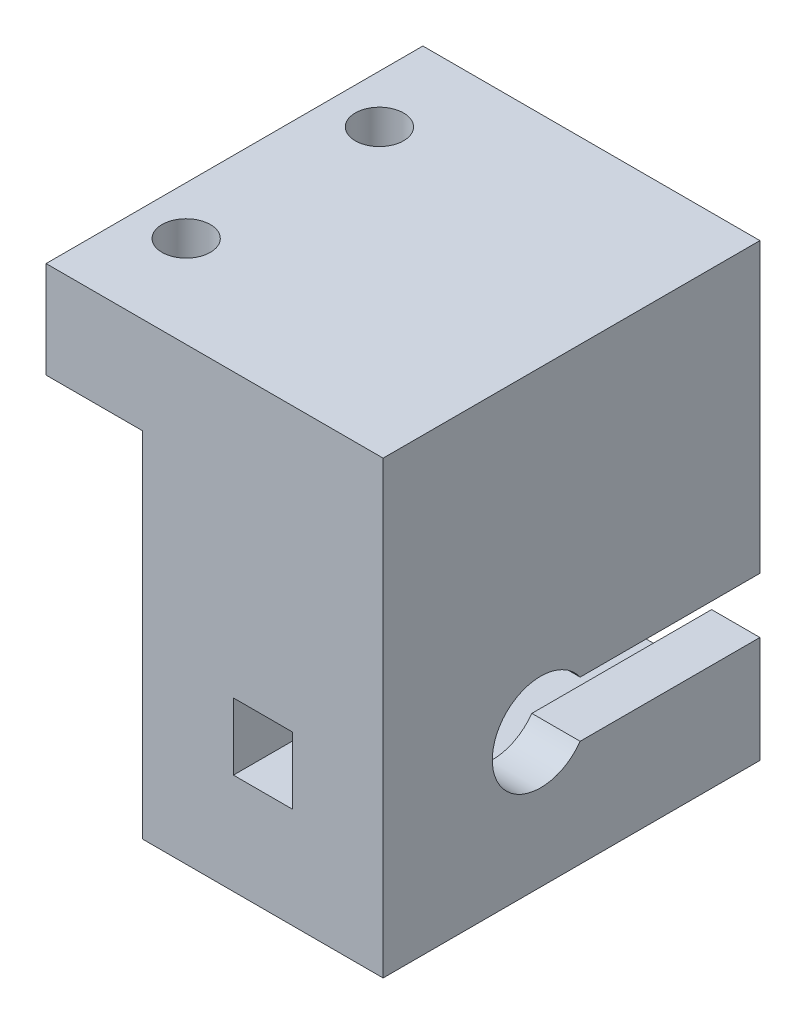
ISO-10303-21;
HEADER;
FILE_DESCRIPTION(('STEP AP214'),'2;1');
FILE_NAME('part.step','',(''),(''),'','','');
FILE_SCHEMA(('AUTOMOTIVE_DESIGN { 1 0 10303 214 1 1 1 1 }'));
ENDSEC;
DATA;
#1=APPLICATION_CONTEXT('core data for automotive mechanical design processes');
#2=APPLICATION_PROTOCOL_DEFINITION('international standard','automotive_design',2000,#1);
#3=PRODUCT_CONTEXT('',#1,'mechanical');
#4=PRODUCT('Part','Part','',(#3));
#5=PRODUCT_RELATED_PRODUCT_CATEGORY('part','',(#4));
#6=PRODUCT_DEFINITION_FORMATION('','',#4);
#7=PRODUCT_DEFINITION_CONTEXT('part definition',#1,'design');
#8=PRODUCT_DEFINITION('design','',#6,#7);
#9=PRODUCT_DEFINITION_SHAPE('','',#8);
#10=(LENGTH_UNIT() NAMED_UNIT(*) SI_UNIT(.MILLI.,.METRE.));
#11=(NAMED_UNIT(*) PLANE_ANGLE_UNIT() SI_UNIT($,.RADIAN.));
#12=(NAMED_UNIT(*) SI_UNIT($,.STERADIAN.) SOLID_ANGLE_UNIT());
#13=UNCERTAINTY_MEASURE_WITH_UNIT(LENGTH_MEASURE(1.E-05),#10,'distance_accuracy_value','');
#14=(GEOMETRIC_REPRESENTATION_CONTEXT(3) GLOBAL_UNCERTAINTY_ASSIGNED_CONTEXT((#13)) GLOBAL_UNIT_ASSIGNED_CONTEXT((#10,
#11,#12)) REPRESENTATION_CONTEXT('',''));
#15=CARTESIAN_POINT('',(0.,0.,0.));
#16=DIRECTION('',(0.,0.,1.));
#17=DIRECTION('',(1.,0.,0.));
#18=AXIS2_PLACEMENT_3D('',#15,#16,#17);
#19=CARTESIAN_POINT('',(-28.5,0.,0.));
#20=DIRECTION('',(-1.,0.,0.));
#21=DIRECTION('',(0.,0.,-1.));
#22=AXIS2_PLACEMENT_3D('',#19,#20,#21);
#23=PLANE('',#22);
#24=DIRECTION('',(0.,1.,0.));
#25=VECTOR('',#24,1.);
#26=CARTESIAN_POINT('',(-28.5,28.826000006,0.));
#27=LINE('',#26,#25);
#28=CARTESIAN_POINT('',(-28.5,28.826000006,0.));
#29=VERTEX_POINT('',#28);
#30=CARTESIAN_POINT('',(-28.5,41.526000006,0.));
#31=VERTEX_POINT('',#30);
#32=EDGE_CURVE('E202',#29,#31,#27,.T.);
#33=ORIENTED_EDGE('',*,*,#32,.F.);
#34=DIRECTION('',(0.,0.,-1.));
#35=VECTOR('',#34,1.);
#36=CARTESIAN_POINT('',(-28.5,28.826000006,49.525));
#37=LINE('',#36,#35);
#38=CARTESIAN_POINT('',(-28.5,28.826000006,49.525));
#39=VERTEX_POINT('',#38);
#40=EDGE_CURVE('E190',#39,#29,#37,.T.);
#41=ORIENTED_EDGE('',*,*,#40,.F.);
#42=DIRECTION('',(0.,-1.,0.));
#43=VECTOR('',#42,1.);
#44=CARTESIAN_POINT('',(-28.5,28.826000006,49.525));
#45=LINE('',#44,#43);
#46=CARTESIAN_POINT('',(-28.5,41.526000006,49.525));
#47=VERTEX_POINT('',#46);
#48=EDGE_CURVE('E213',#47,#39,#45,.T.);
#49=ORIENTED_EDGE('',*,*,#48,.F.);
#50=DIRECTION('',(0.,0.,1.));
#51=VECTOR('',#50,1.);
#52=CARTESIAN_POINT('',(-28.5,41.526000006,49.525));
#53=LINE('',#52,#51);
#54=EDGE_CURVE('E211',#31,#47,#53,.T.);
#55=ORIENTED_EDGE('',*,*,#54,.F.);
#56=EDGE_LOOP('',(#33,#41,#49,#55));
#57=FACE_BOUND('',#56,.T.);
#58=ADVANCED_FACE('F43',(#57),#23,.T.);
#59=CARTESIAN_POINT('',(-15.8,-17.650000006,40.));
#60=DIRECTION('',(1.,0.,0.));
#61=DIRECTION('',(0.,0.,-1.));
#62=AXIS2_PLACEMENT_3D('',#59,#60,#61);
#63=PLANE('',#62);
#64=DIRECTION('',(0.,-1.,0.));
#65=VECTOR('',#64,1.);
#66=CARTESIAN_POINT('',(-15.8,0.,49.525));
#67=LINE('',#66,#65);
#68=CARTESIAN_POINT('',(-15.8,28.826000006,49.525));
#69=VERTEX_POINT('',#68);
#70=CARTESIAN_POINT('',(-15.8,-17.650000006,49.525));
#71=VERTEX_POINT('',#70);
#72=EDGE_CURVE('E263',#69,#71,#67,.T.);
#73=ORIENTED_EDGE('',*,*,#72,.F.);
#74=DIRECTION('',(0.,0.,1.));
#75=VECTOR('',#74,1.);
#76=CARTESIAN_POINT('',(-15.8,28.826000006,49.525));
#77=LINE('',#76,#75);
#78=CARTESIAN_POINT('',(-15.8,28.826000006,0.));
#79=VERTEX_POINT('',#78);
#80=EDGE_CURVE('E207',#79,#69,#77,.T.);
#81=ORIENTED_EDGE('',*,*,#80,.F.);
#82=DIRECTION('',(0.,-1.,0.));
#83=VECTOR('',#82,1.);
#84=CARTESIAN_POINT('',(-15.8,-17.650000006,0.));
#85=LINE('',#84,#83);
#86=CARTESIAN_POINT('',(-15.8,3.65,0.));
#87=VERTEX_POINT('',#86);
#88=EDGE_CURVE('E205',#79,#87,#85,.T.);
#89=ORIENTED_EDGE('',*,*,#88,.T.);
#90=DIRECTION('',(0.,0.,1.));
#91=VECTOR('',#90,1.);
#92=CARTESIAN_POINT('',(-15.8,3.65,40.));
#93=LINE('',#92,#91);
#94=CARTESIAN_POINT('',(-15.8,3.65,28.8275759845004));
#95=VERTEX_POINT('',#94);
#96=EDGE_CURVE('E243',#87,#95,#93,.T.);
#97=ORIENTED_EDGE('',*,*,#96,.T.);
#98=CARTESIAN_POINT('',(-15.8,0.,28.8275759845004));
#99=DIRECTION('',(1.,0.,0.));
#100=DIRECTION('',(0.,0.,-1.));
#101=AXIS2_PLACEMENT_3D('',#98,#99,#100);
#102=CIRCLE('',#101,3.65);
#103=CARTESIAN_POINT('',(-15.8,-3.65,28.8275759845004));
#104=VERTEX_POINT('',#103);
#105=EDGE_CURVE('E246',#95,#104,#102,.T.);
#106=ORIENTED_EDGE('',*,*,#105,.T.);
#107=DIRECTION('',(0.,0.,-1.));
#108=VECTOR('',#107,1.);
#109=CARTESIAN_POINT('',(-15.8,-3.65,40.));
#110=LINE('',#109,#108);
#111=CARTESIAN_POINT('',(-15.8,-3.65,0.));
#112=VERTEX_POINT('',#111);
#113=EDGE_CURVE('E238',#104,#112,#110,.T.);
#114=ORIENTED_EDGE('',*,*,#113,.T.);
#115=CARTESIAN_POINT('',(-15.8,-17.650000006,0.));
#116=VERTEX_POINT('',#115);
#117=EDGE_CURVE('E313',#112,#116,#85,.T.);
#118=ORIENTED_EDGE('',*,*,#117,.T.);
#119=DIRECTION('',(0.,0.,-1.));
#120=VECTOR('',#119,1.);
#121=CARTESIAN_POINT('',(-15.8,-17.650000006,40.));
#122=LINE('',#121,#120);
#123=EDGE_CURVE('E324',#71,#116,#122,.T.);
#124=ORIENTED_EDGE('',*,*,#123,.F.);
#125=EDGE_LOOP('',(#73,#81,#89,#97,#106,#114,#118,#124));
#126=FACE_BOUND('',#125,.T.);
#127=ADVANCED_FACE('F45',(#126),#63,.F.);
#128=CARTESIAN_POINT('',(0.,0.,0.));
#129=DIRECTION('',(0.,0.,-1.));
#130=DIRECTION('',(-1.,0.,0.));
#131=AXIS2_PLACEMENT_3D('',#128,#129,#130);
#132=PLANE('',#131);
#133=ORIENTED_EDGE('',*,*,#88,.F.);
#134=DIRECTION('',(1.,0.,0.));
#135=VECTOR('',#134,1.);
#136=CARTESIAN_POINT('',(-28.5,28.826000006,0.));
#137=LINE('',#136,#135);
#138=EDGE_CURVE('E194',#29,#79,#137,.T.);
#139=ORIENTED_EDGE('',*,*,#138,.F.);
#140=ORIENTED_EDGE('',*,*,#32,.T.);
#141=DIRECTION('',(-1.,0.,0.));
#142=VECTOR('',#141,1.);
#143=CARTESIAN_POINT('',(15.8,41.526000006,0.));
#144=LINE('',#143,#142);
#145=CARTESIAN_POINT('',(15.8,41.526000006,0.));
#146=VERTEX_POINT('',#145);
#147=EDGE_CURVE('E417',#146,#31,#144,.T.);
#148=ORIENTED_EDGE('',*,*,#147,.F.);
#149=DIRECTION('',(0.,1.,0.));
#150=VECTOR('',#149,1.);
#151=CARTESIAN_POINT('',(15.8,-17.650000006,0.));
#152=LINE('',#151,#150);
#153=CARTESIAN_POINT('',(15.8,3.65,0.));
#154=VERTEX_POINT('',#153);
#155=EDGE_CURVE('E317',#154,#146,#152,.T.);
#156=ORIENTED_EDGE('',*,*,#155,.F.);
#157=DIRECTION('',(1.,0.,0.));
#158=VECTOR('',#157,1.);
#159=CARTESIAN_POINT('',(-15.95,3.65,0.));
#160=LINE('',#159,#158);
#161=CARTESIAN_POINT('',(9.45,3.65,0.));
#162=VERTEX_POINT('',#161);
#163=EDGE_CURVE('E229',#162,#154,#160,.T.);
#164=ORIENTED_EDGE('',*,*,#163,.F.);
#165=DIRECTION('',(0.,1.,0.));
#166=VECTOR('',#165,1.);
#167=CARTESIAN_POINT('',(9.45,-11.300000006,0.));
#168=LINE('',#167,#166);
#169=CARTESIAN_POINT('',(9.45,11.300000006,0.));
#170=VERTEX_POINT('',#169);
#171=EDGE_CURVE('E276',#162,#170,#168,.T.);
#172=ORIENTED_EDGE('',*,*,#171,.T.);
#173=DIRECTION('',(-1.,0.,0.));
#174=VECTOR('',#173,1.);
#175=CARTESIAN_POINT('',(-9.45,11.300000006,0.));
#176=LINE('',#175,#174);
#177=CARTESIAN_POINT('',(-9.45,11.300000006,0.));
#178=VERTEX_POINT('',#177);
#179=EDGE_CURVE('E294',#170,#178,#176,.T.);
#180=ORIENTED_EDGE('',*,*,#179,.T.);
#181=DIRECTION('',(0.,-1.,0.));
#182=VECTOR('',#181,1.);
#183=CARTESIAN_POINT('',(-9.45,-11.300000006,0.));
#184=LINE('',#183,#182);
#185=CARTESIAN_POINT('',(-9.45,3.65,0.));
#186=VERTEX_POINT('',#185);
#187=EDGE_CURVE('E298',#178,#186,#184,.T.);
#188=ORIENTED_EDGE('',*,*,#187,.T.);
#189=EDGE_CURVE('E228',#87,#186,#160,.T.);
#190=ORIENTED_EDGE('',*,*,#189,.F.);
#191=EDGE_LOOP('',(#133,#139,#140,#148,#156,#164,#172,#180,#188,#190));
#192=FACE_BOUND('',#191,.T.);
#193=ADVANCED_FACE('F200',(#192),#132,.T.);
#194=CARTESIAN_POINT('',(0.,0.,40.));
#195=DIRECTION('',(0.,0.,1.));
#196=DIRECTION('',(1.,0.,0.));
#197=AXIS2_PLACEMENT_3D('',#194,#195,#196);
#198=PLANE('',#197);
#199=DIRECTION('',(0.,1.,0.));
#200=VECTOR('',#199,1.);
#201=CARTESIAN_POINT('',(9.45,-11.300000006,40.));
#202=LINE('',#201,#200);
#203=CARTESIAN_POINT('',(9.45,-11.300000006,40.));
#204=VERTEX_POINT('',#203);
#205=CARTESIAN_POINT('',(9.45,11.300000006,40.));
#206=VERTEX_POINT('',#205);
#207=EDGE_CURVE('E277',#204,#206,#202,.T.);
#208=ORIENTED_EDGE('',*,*,#207,.F.);
#209=DIRECTION('',(1.,0.,0.));
#210=VECTOR('',#209,1.);
#211=CARTESIAN_POINT('',(-9.45,-11.300000006,40.));
#212=LINE('',#211,#210);
#213=CARTESIAN_POINT('',(-9.45,-11.300000006,40.));
#214=VERTEX_POINT('',#213);
#215=EDGE_CURVE('E287',#214,#204,#212,.T.);
#216=ORIENTED_EDGE('',*,*,#215,.F.);
#217=DIRECTION('',(0.,-1.,0.));
#218=VECTOR('',#217,1.);
#219=CARTESIAN_POINT('',(-9.45,-11.300000006,40.));
#220=LINE('',#219,#218);
#221=CARTESIAN_POINT('',(-9.45,11.300000006,40.));
#222=VERTEX_POINT('',#221);
#223=EDGE_CURVE('E284',#222,#214,#220,.T.);
#224=ORIENTED_EDGE('',*,*,#223,.F.);
#225=DIRECTION('',(-1.,0.,0.));
#226=VECTOR('',#225,1.);
#227=CARTESIAN_POINT('',(-9.45,11.300000006,40.));
#228=LINE('',#227,#226);
#229=EDGE_CURVE('E280',#206,#222,#228,.T.);
#230=ORIENTED_EDGE('',*,*,#229,.F.);
#231=EDGE_LOOP('',(#208,#216,#224,#230));
#232=FACE_BOUND('',#231,.T.);
#233=DIRECTION('',(0.,1.,0.));
#234=VECTOR('',#233,1.);
#235=CARTESIAN_POINT('',(-3.8745434853159,4.39429931871205,40.));
#236=LINE('',#235,#234);
#237=CARTESIAN_POINT('',(-3.8745434853159,-4.39429931871205,40.));
#238=VERTEX_POINT('',#237);
#239=CARTESIAN_POINT('',(-3.8745434853159,4.39429931871205,40.));
#240=VERTEX_POINT('',#239);
#241=EDGE_CURVE('E249',#238,#240,#236,.T.);
#242=ORIENTED_EDGE('',*,*,#241,.F.);
#243=DIRECTION('',(-1.,0.,0.));
#244=VECTOR('',#243,1.);
#245=CARTESIAN_POINT('',(3.8745434853159,-4.39429931871205,40.));
#246=LINE('',#245,#244);
#247=CARTESIAN_POINT('',(3.8745434853159,-4.39429931871205,40.));
#248=VERTEX_POINT('',#247);
#249=EDGE_CURVE('E257',#248,#238,#246,.T.);
#250=ORIENTED_EDGE('',*,*,#249,.F.);
#251=DIRECTION('',(0.,-1.,0.));
#252=VECTOR('',#251,1.);
#253=CARTESIAN_POINT('',(3.8745434853159,4.39429931871205,40.));
#254=LINE('',#253,#252);
#255=CARTESIAN_POINT('',(3.8745434853159,4.39429931871205,40.));
#256=VERTEX_POINT('',#255);
#257=EDGE_CURVE('E255',#256,#248,#254,.T.);
#258=ORIENTED_EDGE('',*,*,#257,.F.);
#259=DIRECTION('',(1.,0.,0.));
#260=VECTOR('',#259,1.);
#261=CARTESIAN_POINT('',(3.8745434853159,4.39429931871205,40.));
#262=LINE('',#261,#260);
#263=EDGE_CURVE('E252',#240,#256,#262,.T.);
#264=ORIENTED_EDGE('',*,*,#263,.F.);
#265=EDGE_LOOP('',(#242,#250,#258,#264));
#266=FACE_BOUND('',#265,.T.);
#267=ADVANCED_FACE('F371',(#232,#266),#198,.F.);
#268=DIRECTION('',(1.,0.,0.));
#269=VECTOR('',#268,1.);
#270=CARTESIAN_POINT('',(-15.95,-3.65,0.));
#271=LINE('',#270,#269);
#272=CARTESIAN_POINT('',(9.45,-3.65,0.));
#273=VERTEX_POINT('',#272);
#274=CARTESIAN_POINT('',(15.8,-3.65,0.));
#275=VERTEX_POINT('',#274);
#276=EDGE_CURVE('E232',#273,#275,#271,.T.);
#277=ORIENTED_EDGE('',*,*,#276,.T.);
#278=CARTESIAN_POINT('',(15.8,-17.650000006,0.));
#279=VERTEX_POINT('',#278);
#280=EDGE_CURVE('E318',#279,#275,#152,.T.);
#281=ORIENTED_EDGE('',*,*,#280,.F.);
#282=DIRECTION('',(1.,0.,0.));
#283=VECTOR('',#282,1.);
#284=CARTESIAN_POINT('',(-15.8,-17.650000006,0.));
#285=LINE('',#284,#283);
#286=EDGE_CURVE('E315',#116,#279,#285,.T.);
#287=ORIENTED_EDGE('',*,*,#286,.F.);
#288=ORIENTED_EDGE('',*,*,#117,.F.);
#289=CARTESIAN_POINT('',(-9.45,-3.65,0.));
#290=VERTEX_POINT('',#289);
#291=EDGE_CURVE('E231',#112,#290,#271,.T.);
#292=ORIENTED_EDGE('',*,*,#291,.T.);
#293=CARTESIAN_POINT('',(-9.45,-11.300000006,0.));
#294=VERTEX_POINT('',#293);
#295=EDGE_CURVE('E297',#290,#294,#184,.T.);
#296=ORIENTED_EDGE('',*,*,#295,.T.);
#297=DIRECTION('',(1.,0.,0.));
#298=VECTOR('',#297,1.);
#299=CARTESIAN_POINT('',(-9.45,-11.300000006,0.));
#300=LINE('',#299,#298);
#301=CARTESIAN_POINT('',(9.45,-11.300000006,0.));
#302=VERTEX_POINT('',#301);
#303=EDGE_CURVE('E281',#294,#302,#300,.T.);
#304=ORIENTED_EDGE('',*,*,#303,.T.);
#305=EDGE_CURVE('E291',#302,#273,#168,.T.);
#306=ORIENTED_EDGE('',*,*,#305,.T.);
#307=EDGE_LOOP('',(#277,#281,#287,#288,#292,#296,#304,#306));
#308=FACE_BOUND('',#307,.T.);
#309=ADVANCED_FACE('F359',(#308),#132,.T.);
#310=CARTESIAN_POINT('',(-15.8,-17.650000006,40.));
#311=DIRECTION('',(0.,1.,0.));
#312=DIRECTION('',(0.,0.,1.));
#313=AXIS2_PLACEMENT_3D('',#310,#311,#312);
#314=PLANE('',#313);
#315=ORIENTED_EDGE('',*,*,#286,.T.);
#316=DIRECTION('',(0.,0.,-1.));
#317=VECTOR('',#316,1.);
#318=CARTESIAN_POINT('',(15.8,-17.650000006,40.));
#319=LINE('',#318,#317);
#320=CARTESIAN_POINT('',(15.8,-17.650000006,49.525));
#321=VERTEX_POINT('',#320);
#322=EDGE_CURVE('E321',#321,#279,#319,.T.);
#323=ORIENTED_EDGE('',*,*,#322,.F.);
#324=DIRECTION('',(1.,0.,0.));
#325=VECTOR('',#324,1.);
#326=CARTESIAN_POINT('',(0.,-17.650000006,49.525));
#327=LINE('',#326,#325);
#328=EDGE_CURVE('E271',#71,#321,#327,.T.);
#329=ORIENTED_EDGE('',*,*,#328,.F.);
#330=ORIENTED_EDGE('',*,*,#123,.T.);
#331=EDGE_LOOP('',(#315,#323,#329,#330));
#332=FACE_BOUND('',#331,.T.);
#333=ADVANCED_FACE('F390',(#332),#314,.F.);
#334=CARTESIAN_POINT('',(15.8,-17.650000006,40.));
#335=DIRECTION('',(-1.,0.,0.));
#336=DIRECTION('',(0.,0.,1.));
#337=AXIS2_PLACEMENT_3D('',#334,#335,#336);
#338=PLANE('',#337);
#339=DIRECTION('',(0.,0.,-1.));
#340=VECTOR('',#339,1.);
#341=CARTESIAN_POINT('',(15.8,-3.65,0.));
#342=LINE('',#341,#340);
#343=CARTESIAN_POINT('',(15.8,-3.65,23.6314235617938));
#344=VERTEX_POINT('',#343);
#345=EDGE_CURVE('E212',#344,#275,#342,.T.);
#346=ORIENTED_EDGE('',*,*,#345,.F.);
#347=CARTESIAN_POINT('',(15.8,0.,28.8275759845004));
#348=DIRECTION('',(1.,0.,0.));
#349=DIRECTION('',(0.,0.,-1.));
#350=AXIS2_PLACEMENT_3D('',#347,#348,#349);
#351=CIRCLE('',#350,6.35);
#352=CARTESIAN_POINT('',(15.8,3.65,23.6314235617938));
#353=VERTEX_POINT('',#352);
#354=EDGE_CURVE('E66',#353,#344,#351,.T.);
#355=ORIENTED_EDGE('',*,*,#354,.F.);
#356=DIRECTION('',(0.,0.,1.));
#357=VECTOR('',#356,1.);
#358=CARTESIAN_POINT('',(15.8,3.65,28.8275759845004));
#359=LINE('',#358,#357);
#360=EDGE_CURVE('E215',#154,#353,#359,.T.);
#361=ORIENTED_EDGE('',*,*,#360,.F.);
#362=ORIENTED_EDGE('',*,*,#155,.T.);
#363=DIRECTION('',(0.,0.,-1.));
#364=VECTOR('',#363,1.);
#365=CARTESIAN_POINT('',(15.8,41.526000006,49.525));
#366=LINE('',#365,#364);
#367=CARTESIAN_POINT('',(15.8,41.526000006,49.525));
#368=VERTEX_POINT('',#367);
#369=EDGE_CURVE('E414',#368,#146,#366,.T.);
#370=ORIENTED_EDGE('',*,*,#369,.F.);
#371=DIRECTION('',(0.,1.,0.));
#372=VECTOR('',#371,1.);
#373=CARTESIAN_POINT('',(15.8,0.,49.525));
#374=LINE('',#373,#372);
#375=EDGE_CURVE('E274',#321,#368,#374,.T.);
#376=ORIENTED_EDGE('',*,*,#375,.F.);
#377=ORIENTED_EDGE('',*,*,#322,.T.);
#378=ORIENTED_EDGE('',*,*,#280,.T.);
#379=EDGE_LOOP('',(#346,#355,#361,#362,#370,#376,#377,#378));
#380=FACE_BOUND('',#379,.T.);
#381=ADVANCED_FACE('F386',(#380),#338,.F.);
#382=CARTESIAN_POINT('',(9.45,-11.300000006,40.));
#383=DIRECTION('',(-1.,0.,0.));
#384=DIRECTION('',(0.,0.,1.));
#385=AXIS2_PLACEMENT_3D('',#382,#383,#384);
#386=PLANE('',#385);
#387=CARTESIAN_POINT('',(9.45,0.,28.8275759845004));
#388=DIRECTION('',(1.,0.,0.));
#389=DIRECTION('',(0.,0.,-1.));
#390=AXIS2_PLACEMENT_3D('',#387,#388,#389);
#391=CIRCLE('',#390,6.35);
#392=CARTESIAN_POINT('',(9.45,3.65,23.6314235617938));
#393=VERTEX_POINT('',#392);
#394=CARTESIAN_POINT('',(9.45,-3.65,23.6314235617938));
#395=VERTEX_POINT('',#394);
#396=EDGE_CURVE('E419',#393,#395,#391,.T.);
#397=ORIENTED_EDGE('',*,*,#396,.T.);
#398=DIRECTION('',(0.,0.,1.));
#399=VECTOR('',#398,1.);
#400=CARTESIAN_POINT('',(9.45,-3.65,40.));
#401=LINE('',#400,#399);
#402=EDGE_CURVE('E227',#273,#395,#401,.T.);
#403=ORIENTED_EDGE('',*,*,#402,.F.);
#404=ORIENTED_EDGE('',*,*,#305,.F.);
#405=DIRECTION('',(0.,0.,-1.));
#406=VECTOR('',#405,1.);
#407=CARTESIAN_POINT('',(9.45,-11.300000006,40.));
#408=LINE('',#407,#406);
#409=EDGE_CURVE('E290',#204,#302,#408,.T.);
#410=ORIENTED_EDGE('',*,*,#409,.F.);
#411=ORIENTED_EDGE('',*,*,#207,.T.);
#412=DIRECTION('',(0.,0.,-1.));
#413=VECTOR('',#412,1.);
#414=CARTESIAN_POINT('',(9.45,11.300000006,40.));
#415=LINE('',#414,#413);
#416=EDGE_CURVE('E310',#206,#170,#415,.T.);
#417=ORIENTED_EDGE('',*,*,#416,.T.);
#418=ORIENTED_EDGE('',*,*,#171,.F.);
#419=DIRECTION('',(0.,0.,-1.));
#420=VECTOR('',#419,1.);
#421=CARTESIAN_POINT('',(9.45,3.65,40.));
#422=LINE('',#421,#420);
#423=EDGE_CURVE('E241',#393,#162,#422,.T.);
#424=ORIENTED_EDGE('',*,*,#423,.F.);
#425=EDGE_LOOP('',(#397,#403,#404,#410,#411,#417,#418,#424));
#426=FACE_BOUND('',#425,.T.);
#427=ADVANCED_FACE('F376',(#426),#386,.T.);
#428=CARTESIAN_POINT('',(-9.45,11.300000006,40.));
#429=DIRECTION('',(0.,-1.,0.));
#430=DIRECTION('',(0.,0.,-1.));
#431=AXIS2_PLACEMENT_3D('',#428,#429,#430);
#432=PLANE('',#431);
#433=ORIENTED_EDGE('',*,*,#179,.F.);
#434=ORIENTED_EDGE('',*,*,#416,.F.);
#435=ORIENTED_EDGE('',*,*,#229,.T.);
#436=DIRECTION('',(0.,0.,-1.));
#437=VECTOR('',#436,1.);
#438=CARTESIAN_POINT('',(-9.45,11.300000006,40.));
#439=LINE('',#438,#437);
#440=EDGE_CURVE('E308',#222,#178,#439,.T.);
#441=ORIENTED_EDGE('',*,*,#440,.T.);
#442=EDGE_LOOP('',(#433,#434,#435,#441));
#443=FACE_BOUND('',#442,.T.);
#444=ADVANCED_FACE('F368',(#443),#432,.T.);
#445=CARTESIAN_POINT('',(-9.45,-11.300000006,40.));
#446=DIRECTION('',(1.,0.,0.));
#447=DIRECTION('',(0.,0.,-1.));
#448=AXIS2_PLACEMENT_3D('',#445,#446,#447);
#449=PLANE('',#448);
#450=DIRECTION('',(0.,0.,1.));
#451=VECTOR('',#450,1.);
#452=CARTESIAN_POINT('',(-9.45,3.65,40.));
#453=LINE('',#452,#451);
#454=CARTESIAN_POINT('',(-9.45,3.65,28.8275759845004));
#455=VERTEX_POINT('',#454);
#456=EDGE_CURVE('E51',#186,#455,#453,.T.);
#457=ORIENTED_EDGE('',*,*,#456,.F.);
#458=ORIENTED_EDGE('',*,*,#187,.F.);
#459=ORIENTED_EDGE('',*,*,#440,.F.);
#460=ORIENTED_EDGE('',*,*,#223,.T.);
#461=DIRECTION('',(0.,0.,-1.));
#462=VECTOR('',#461,1.);
#463=CARTESIAN_POINT('',(-9.45,-11.300000006,40.));
#464=LINE('',#463,#462);
#465=EDGE_CURVE('E305',#214,#294,#464,.T.);
#466=ORIENTED_EDGE('',*,*,#465,.T.);
#467=ORIENTED_EDGE('',*,*,#295,.F.);
#468=DIRECTION('',(0.,0.,-1.));
#469=VECTOR('',#468,1.);
#470=CARTESIAN_POINT('',(-9.45,-3.65,40.));
#471=LINE('',#470,#469);
#472=CARTESIAN_POINT('',(-9.45,-3.65,28.8275759845004));
#473=VERTEX_POINT('',#472);
#474=EDGE_CURVE('E336',#473,#290,#471,.T.);
#475=ORIENTED_EDGE('',*,*,#474,.F.);
#476=CARTESIAN_POINT('',(-9.45,0.,28.8275759845004));
#477=DIRECTION('',(1.,0.,0.));
#478=DIRECTION('',(0.,0.,-1.));
#479=AXIS2_PLACEMENT_3D('',#476,#477,#478);
#480=CIRCLE('',#479,3.65);
#481=EDGE_CURVE('E338',#455,#473,#480,.T.);
#482=ORIENTED_EDGE('',*,*,#481,.F.);
#483=EDGE_LOOP('',(#457,#458,#459,#460,#466,#467,#475,#482));
#484=FACE_BOUND('',#483,.T.);
#485=ADVANCED_FACE('F352',(#484),#449,.T.);
#486=CARTESIAN_POINT('',(-9.45,-11.300000006,40.));
#487=DIRECTION('',(0.,1.,0.));
#488=DIRECTION('',(0.,0.,1.));
#489=AXIS2_PLACEMENT_3D('',#486,#487,#488);
#490=PLANE('',#489);
#491=ORIENTED_EDGE('',*,*,#303,.F.);
#492=ORIENTED_EDGE('',*,*,#465,.F.);
#493=ORIENTED_EDGE('',*,*,#215,.T.);
#494=ORIENTED_EDGE('',*,*,#409,.T.);
#495=EDGE_LOOP('',(#491,#492,#493,#494));
#496=FACE_BOUND('',#495,.T.);
#497=ADVANCED_FACE('F381',(#496),#490,.T.);
#498=CARTESIAN_POINT('',(0.,0.,49.525));
#499=DIRECTION('',(0.,0.,1.));
#500=DIRECTION('',(1.,0.,0.));
#501=AXIS2_PLACEMENT_3D('',#498,#499,#500);
#502=PLANE('',#501);
#503=DIRECTION('',(-1.,0.,0.));
#504=VECTOR('',#503,1.);
#505=CARTESIAN_POINT('',(-28.5,28.826000006,49.525));
#506=LINE('',#505,#504);
#507=EDGE_CURVE('E58',#69,#39,#506,.T.);
#508=ORIENTED_EDGE('',*,*,#507,.F.);
#509=ORIENTED_EDGE('',*,*,#72,.T.);
#510=ORIENTED_EDGE('',*,*,#328,.T.);
#511=ORIENTED_EDGE('',*,*,#375,.T.);
#512=DIRECTION('',(1.,0.,0.));
#513=VECTOR('',#512,1.);
#514=CARTESIAN_POINT('',(15.8,41.526000006,49.525));
#515=LINE('',#514,#513);
#516=EDGE_CURVE('E412',#47,#368,#515,.T.);
#517=ORIENTED_EDGE('',*,*,#516,.F.);
#518=ORIENTED_EDGE('',*,*,#48,.T.);
#519=EDGE_LOOP('',(#508,#509,#510,#511,#517,#518));
#520=FACE_BOUND('',#519,.T.);
#521=DIRECTION('',(0.,-1.,0.));
#522=VECTOR('',#521,1.);
#523=CARTESIAN_POINT('',(-3.8745434853159,0.,49.525));
#524=LINE('',#523,#522);
#525=CARTESIAN_POINT('',(-3.8745434853159,4.39429931871205,49.525));
#526=VERTEX_POINT('',#525);
#527=CARTESIAN_POINT('',(-3.8745434853159,-4.39429931871205,49.525));
#528=VERTEX_POINT('',#527);
#529=EDGE_CURVE('E334',#526,#528,#524,.T.);
#530=ORIENTED_EDGE('',*,*,#529,.F.);
#531=DIRECTION('',(-1.,0.,0.));
#532=VECTOR('',#531,1.);
#533=CARTESIAN_POINT('',(0.,4.39429931871205,49.525));
#534=LINE('',#533,#532);
#535=CARTESIAN_POINT('',(3.8745434853159,4.39429931871205,49.525));
#536=VERTEX_POINT('',#535);
#537=EDGE_CURVE('E327',#536,#526,#534,.T.);
#538=ORIENTED_EDGE('',*,*,#537,.F.);
#539=DIRECTION('',(0.,1.,0.));
#540=VECTOR('',#539,1.);
#541=CARTESIAN_POINT('',(3.8745434853159,0.,49.525));
#542=LINE('',#541,#540);
#543=CARTESIAN_POINT('',(3.8745434853159,-4.39429931871205,49.525));
#544=VERTEX_POINT('',#543);
#545=EDGE_CURVE('E329',#544,#536,#542,.T.);
#546=ORIENTED_EDGE('',*,*,#545,.F.);
#547=DIRECTION('',(1.,0.,0.));
#548=VECTOR('',#547,1.);
#549=CARTESIAN_POINT('',(0.,-4.39429931871205,49.525));
#550=LINE('',#549,#548);
#551=EDGE_CURVE('E332',#528,#544,#550,.T.);
#552=ORIENTED_EDGE('',*,*,#551,.F.);
#553=EDGE_LOOP('',(#530,#538,#546,#552));
#554=FACE_BOUND('',#553,.T.);
#555=ADVANCED_FACE('F392',(#520,#554),#502,.T.);
#556=CARTESIAN_POINT('',(-3.8745434853159,4.39429931871205,52.7));
#557=DIRECTION('',(-1.,0.,0.));
#558=DIRECTION('',(0.,0.,1.));
#559=AXIS2_PLACEMENT_3D('',#556,#557,#558);
#560=PLANE('',#559);
#561=ORIENTED_EDGE('',*,*,#529,.T.);
#562=DIRECTION('',(0.,0.,-1.));
#563=VECTOR('',#562,1.);
#564=CARTESIAN_POINT('',(-3.8745434853159,-4.39429931871205,52.7));
#565=LINE('',#564,#563);
#566=EDGE_CURVE('E261',#528,#238,#565,.T.);
#567=ORIENTED_EDGE('',*,*,#566,.T.);
#568=ORIENTED_EDGE('',*,*,#241,.T.);
#569=DIRECTION('',(0.,0.,-1.));
#570=VECTOR('',#569,1.);
#571=CARTESIAN_POINT('',(-3.8745434853159,4.39429931871205,52.7));
#572=LINE('',#571,#570);
#573=EDGE_CURVE('E260',#526,#240,#572,.T.);
#574=ORIENTED_EDGE('',*,*,#573,.F.);
#575=EDGE_LOOP('',(#561,#567,#568,#574));
#576=FACE_BOUND('',#575,.T.);
#577=ADVANCED_FACE('F469',(#576),#560,.F.);
#578=CARTESIAN_POINT('',(3.8745434853159,-4.39429931871205,52.7));
#579=DIRECTION('',(0.,-1.,0.));
#580=DIRECTION('',(0.,0.,-1.));
#581=AXIS2_PLACEMENT_3D('',#578,#579,#580);
#582=PLANE('',#581);
#583=ORIENTED_EDGE('',*,*,#551,.T.);
#584=DIRECTION('',(0.,0.,-1.));
#585=VECTOR('',#584,1.);
#586=CARTESIAN_POINT('',(3.8745434853159,-4.39429931871205,52.7));
#587=LINE('',#586,#585);
#588=EDGE_CURVE('E264',#544,#248,#587,.T.);
#589=ORIENTED_EDGE('',*,*,#588,.T.);
#590=ORIENTED_EDGE('',*,*,#249,.T.);
#591=ORIENTED_EDGE('',*,*,#566,.F.);
#592=EDGE_LOOP('',(#583,#589,#590,#591));
#593=FACE_BOUND('',#592,.T.);
#594=ADVANCED_FACE('F465',(#593),#582,.F.);
#595=CARTESIAN_POINT('',(3.8745434853159,4.39429931871205,52.7));
#596=DIRECTION('',(1.,0.,0.));
#597=DIRECTION('',(0.,0.,-1.));
#598=AXIS2_PLACEMENT_3D('',#595,#596,#597);
#599=PLANE('',#598);
#600=ORIENTED_EDGE('',*,*,#545,.T.);
#601=DIRECTION('',(0.,0.,-1.));
#602=VECTOR('',#601,1.);
#603=CARTESIAN_POINT('',(3.8745434853159,4.39429931871205,52.7));
#604=LINE('',#603,#602);
#605=EDGE_CURVE('E267',#536,#256,#604,.T.);
#606=ORIENTED_EDGE('',*,*,#605,.T.);
#607=ORIENTED_EDGE('',*,*,#257,.T.);
#608=ORIENTED_EDGE('',*,*,#588,.F.);
#609=EDGE_LOOP('',(#600,#606,#607,#608));
#610=FACE_BOUND('',#609,.T.);
#611=ADVANCED_FACE('F468',(#610),#599,.F.);
#612=CARTESIAN_POINT('',(3.8745434853159,4.39429931871205,52.7));
#613=DIRECTION('',(0.,1.,0.));
#614=DIRECTION('',(0.,0.,1.));
#615=AXIS2_PLACEMENT_3D('',#612,#613,#614);
#616=PLANE('',#615);
#617=ORIENTED_EDGE('',*,*,#537,.T.);
#618=ORIENTED_EDGE('',*,*,#573,.T.);
#619=ORIENTED_EDGE('',*,*,#263,.T.);
#620=ORIENTED_EDGE('',*,*,#605,.F.);
#621=EDGE_LOOP('',(#617,#618,#619,#620));
#622=FACE_BOUND('',#621,.T.);
#623=ADVANCED_FACE('F462',(#622),#616,.F.);
#624=CARTESIAN_POINT('',(-15.95,-3.65,0.));
#625=DIRECTION('',(0.,-1.,0.));
#626=DIRECTION('',(0.,0.,-1.));
#627=AXIS2_PLACEMENT_3D('',#624,#625,#626);
#628=PLANE('',#627);
#629=DIRECTION('',(1.,0.,0.));
#630=VECTOR('',#629,1.);
#631=CARTESIAN_POINT('',(-15.95,-3.65,28.8275759845004));
#632=LINE('',#631,#630);
#633=EDGE_CURVE('E223',#104,#473,#632,.T.);
#634=ORIENTED_EDGE('',*,*,#633,.T.);
#635=ORIENTED_EDGE('',*,*,#474,.T.);
#636=ORIENTED_EDGE('',*,*,#291,.F.);
#637=ORIENTED_EDGE('',*,*,#113,.F.);
#638=EDGE_LOOP('',(#634,#635,#636,#637));
#639=FACE_BOUND('',#638,.T.);
#640=ADVANCED_FACE('F356',(#639),#628,.F.);
#641=CARTESIAN_POINT('',(-15.95,3.65,28.8275759845004));
#642=DIRECTION('',(0.,1.,0.));
#643=DIRECTION('',(0.,0.,1.));
#644=AXIS2_PLACEMENT_3D('',#641,#642,#643);
#645=PLANE('',#644);
#646=ORIENTED_EDGE('',*,*,#189,.T.);
#647=ORIENTED_EDGE('',*,*,#456,.T.);
#648=DIRECTION('',(1.,0.,0.));
#649=VECTOR('',#648,1.);
#650=CARTESIAN_POINT('',(-15.95,3.65,28.8275759845004));
#651=LINE('',#650,#649);
#652=EDGE_CURVE('E224',#95,#455,#651,.T.);
#653=ORIENTED_EDGE('',*,*,#652,.F.);
#654=ORIENTED_EDGE('',*,*,#96,.F.);
#655=EDGE_LOOP('',(#646,#647,#653,#654));
#656=FACE_BOUND('',#655,.T.);
#657=ADVANCED_FACE('F343',(#656),#645,.F.);
#658=CARTESIAN_POINT('',(-15.95,0.,28.8275759845004));
#659=DIRECTION('',(1.,0.,0.));
#660=DIRECTION('',(0.,0.,-1.));
#661=AXIS2_PLACEMENT_3D('',#658,#659,#660);
#662=CYLINDRICAL_SURFACE('',#661,3.65);
#663=ORIENTED_EDGE('',*,*,#652,.T.);
#664=ORIENTED_EDGE('',*,*,#481,.T.);
#665=ORIENTED_EDGE('',*,*,#633,.F.);
#666=ORIENTED_EDGE('',*,*,#105,.F.);
#667=EDGE_LOOP('',(#663,#664,#665,#666));
#668=FACE_BOUND('',#667,.T.);
#669=ADVANCED_FACE('F349',(#668),#662,.F.);
#670=ORIENTED_EDGE('',*,*,#360,.T.);
#671=DIRECTION('',(1.,0.,0.));
#672=VECTOR('',#671,1.);
#673=CARTESIAN_POINT('',(9.45,3.65,23.6314235617938));
#674=LINE('',#673,#672);
#675=EDGE_CURVE('E217',#353,#393,#674,.F.);
#676=ORIENTED_EDGE('',*,*,#675,.T.);
#677=ORIENTED_EDGE('',*,*,#423,.T.);
#678=ORIENTED_EDGE('',*,*,#163,.T.);
#679=EDGE_LOOP('',(#670,#676,#677,#678));
#680=FACE_BOUND('',#679,.T.);
#681=ADVANCED_FACE('F424',(#680),#645,.F.);
#682=ORIENTED_EDGE('',*,*,#402,.T.);
#683=DIRECTION('',(1.,0.,0.));
#684=VECTOR('',#683,1.);
#685=CARTESIAN_POINT('',(9.45,-3.65,23.6314235617938));
#686=LINE('',#685,#684);
#687=EDGE_CURVE('E11',#395,#344,#686,.T.);
#688=ORIENTED_EDGE('',*,*,#687,.T.);
#689=ORIENTED_EDGE('',*,*,#345,.T.);
#690=ORIENTED_EDGE('',*,*,#276,.F.);
#691=EDGE_LOOP('',(#682,#688,#689,#690));
#692=FACE_BOUND('',#691,.T.);
#693=ADVANCED_FACE('F450',(#692),#628,.F.);
#694=CARTESIAN_POINT('',(9.45,0.,28.8275759845004));
#695=DIRECTION('',(1.,0.,0.));
#696=DIRECTION('',(0.,0.,-1.));
#697=AXIS2_PLACEMENT_3D('',#694,#695,#696);
#698=CYLINDRICAL_SURFACE('',#697,6.35);
#699=ORIENTED_EDGE('',*,*,#354,.T.);
#700=ORIENTED_EDGE('',*,*,#687,.F.);
#701=ORIENTED_EDGE('',*,*,#396,.F.);
#702=ORIENTED_EDGE('',*,*,#675,.F.);
#703=EDGE_LOOP('',(#699,#700,#701,#702));
#704=FACE_BOUND('',#703,.T.);
#705=ADVANCED_FACE('F444',(#704),#698,.F.);
#706=CARTESIAN_POINT('',(0.,28.826000006,0.));
#707=DIRECTION('',(0.,1.,0.));
#708=DIRECTION('',(0.,0.,1.));
#709=AXIS2_PLACEMENT_3D('',#706,#707,#708);
#710=PLANE('',#709);
#711=CARTESIAN_POINT('',(-22.15,28.826000006,37.4625));
#712=DIRECTION('',(0.,1.,0.));
#713=DIRECTION('',(0.,0.,1.));
#714=AXIS2_PLACEMENT_3D('',#711,#712,#713);
#715=CIRCLE('',#714,3.175);
#716=CARTESIAN_POINT('',(-22.15,28.826000006,40.6375));
#717=VERTEX_POINT('',#716);
#718=EDGE_CURVE('E397',#717,#717,#715,.T.);
#719=ORIENTED_EDGE('',*,*,#718,.T.);
#720=EDGE_LOOP('',(#719));
#721=FACE_BOUND('',#720,.T.);
#722=ORIENTED_EDGE('',*,*,#40,.T.);
#723=ORIENTED_EDGE('',*,*,#138,.T.);
#724=ORIENTED_EDGE('',*,*,#80,.T.);
#725=ORIENTED_EDGE('',*,*,#507,.T.);
#726=EDGE_LOOP('',(#722,#723,#724,#725));
#727=FACE_BOUND('',#726,.T.);
#728=CARTESIAN_POINT('',(-22.15,28.826000006,12.0625));
#729=DIRECTION('',(0.,1.,0.));
#730=DIRECTION('',(0.,0.,1.));
#731=AXIS2_PLACEMENT_3D('',#728,#729,#730);
#732=CIRCLE('',#731,3.175);
#733=CARTESIAN_POINT('',(-22.15,28.826000006,15.2375));
#734=VERTEX_POINT('',#733);
#735=EDGE_CURVE('E403',#734,#734,#732,.T.);
#736=ORIENTED_EDGE('',*,*,#735,.T.);
#737=EDGE_LOOP('',(#736));
#738=FACE_BOUND('',#737,.T.);
#739=ADVANCED_FACE('F192',(#721,#727,#738),#710,.F.);
#740=CARTESIAN_POINT('',(0.,41.526000006,0.));
#741=DIRECTION('',(0.,1.,0.));
#742=DIRECTION('',(0.,0.,1.));
#743=AXIS2_PLACEMENT_3D('',#740,#741,#742);
#744=PLANE('',#743);
#745=CARTESIAN_POINT('',(-22.15,41.526000006,12.0625));
#746=DIRECTION('',(0.,1.,0.));
#747=DIRECTION('',(0.,0.,1.));
#748=AXIS2_PLACEMENT_3D('',#745,#746,#747);
#749=CIRCLE('',#748,3.175);
#750=CARTESIAN_POINT('',(-22.15,41.526000006,15.2375));
#751=VERTEX_POINT('',#750);
#752=EDGE_CURVE('E406',#751,#751,#749,.T.);
#753=ORIENTED_EDGE('',*,*,#752,.F.);
#754=EDGE_LOOP('',(#753));
#755=FACE_BOUND('',#754,.T.);
#756=ORIENTED_EDGE('',*,*,#54,.T.);
#757=ORIENTED_EDGE('',*,*,#516,.T.);
#758=ORIENTED_EDGE('',*,*,#369,.T.);
#759=ORIENTED_EDGE('',*,*,#147,.T.);
#760=EDGE_LOOP('',(#756,#757,#758,#759));
#761=FACE_BOUND('',#760,.T.);
#762=CARTESIAN_POINT('',(-22.15,41.526000006,37.4625));
#763=DIRECTION('',(0.,1.,0.));
#764=DIRECTION('',(0.,0.,1.));
#765=AXIS2_PLACEMENT_3D('',#762,#763,#764);
#766=CIRCLE('',#765,3.175);
#767=CARTESIAN_POINT('',(-22.15,41.526000006,40.6375));
#768=VERTEX_POINT('',#767);
#769=EDGE_CURVE('E400',#768,#768,#766,.T.);
#770=ORIENTED_EDGE('',*,*,#769,.F.);
#771=EDGE_LOOP('',(#770));
#772=FACE_BOUND('',#771,.T.);
#773=ADVANCED_FACE('F429',(#755,#761,#772),#744,.T.);
#774=CARTESIAN_POINT('',(-22.15,41.526000006,12.0625));
#775=DIRECTION('',(0.,-1.,0.));
#776=DIRECTION('',(0.,0.,-1.));
#777=AXIS2_PLACEMENT_3D('',#774,#775,#776);
#778=CYLINDRICAL_SURFACE('',#777,3.175);
#779=ORIENTED_EDGE('',*,*,#752,.T.);
#780=EDGE_LOOP('',(#779));
#781=FACE_BOUND('',#780,.T.);
#782=ORIENTED_EDGE('',*,*,#735,.F.);
#783=EDGE_LOOP('',(#782));
#784=FACE_BOUND('',#783,.T.);
#785=ADVANCED_FACE('F432',(#781,#784),#778,.F.);
#786=CARTESIAN_POINT('',(-22.15,41.526000006,37.4625));
#787=DIRECTION('',(0.,-1.,0.));
#788=DIRECTION('',(0.,0.,-1.));
#789=AXIS2_PLACEMENT_3D('',#786,#787,#788);
#790=CYLINDRICAL_SURFACE('',#789,3.175);
#791=ORIENTED_EDGE('',*,*,#769,.T.);
#792=EDGE_LOOP('',(#791));
#793=FACE_BOUND('',#792,.T.);
#794=ORIENTED_EDGE('',*,*,#718,.F.);
#795=EDGE_LOOP('',(#794));
#796=FACE_BOUND('',#795,.T.);
#797=ADVANCED_FACE('F437',(#793,#796),#790,.F.);
#798=CLOSED_SHELL('',(#58,#127,#193,#267,#309,#333,#381,#427,#444,#485,#497,#555,#577,#594,#611,
#623,#640,#657,#669,#681,#693,#705,#739,#773,#785,#797));
#799=MANIFOLD_SOLID_BREP('B2',#798);
#800=ADVANCED_BREP_SHAPE_REPRESENTATION('',(#18,#799),#14);
#801=SHAPE_DEFINITION_REPRESENTATION(#9,#800);
ENDSEC;
END-ISO-10303-21;
